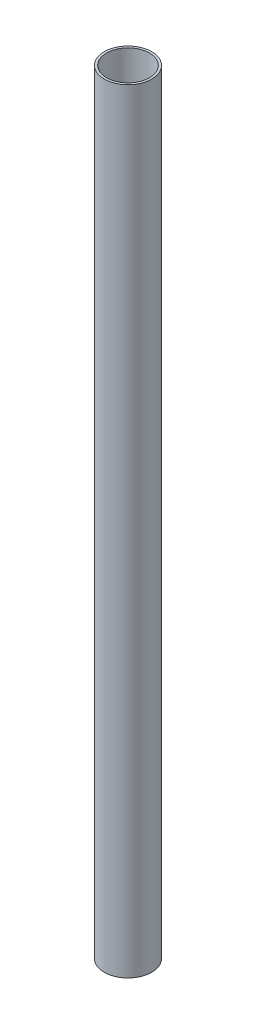
ISO-10303-21;
HEADER;
FILE_DESCRIPTION(('STEP AP214'),'2;1');
FILE_NAME('part.step','',(''),(''),'','','');
FILE_SCHEMA(('AUTOMOTIVE_DESIGN { 1 0 10303 214 1 1 1 1 }'));
ENDSEC;
DATA;
#1=APPLICATION_CONTEXT('core data for automotive mechanical design processes');
#2=APPLICATION_PROTOCOL_DEFINITION('international standard','automotive_design',2000,#1);
#3=PRODUCT_CONTEXT('',#1,'mechanical');
#4=PRODUCT('Part','Part','',(#3));
#5=PRODUCT_RELATED_PRODUCT_CATEGORY('part','',(#4));
#6=PRODUCT_DEFINITION_FORMATION('','',#4);
#7=PRODUCT_DEFINITION_CONTEXT('part definition',#1,'design');
#8=PRODUCT_DEFINITION('design','',#6,#7);
#9=PRODUCT_DEFINITION_SHAPE('','',#8);
#10=(LENGTH_UNIT() NAMED_UNIT(*) SI_UNIT(.MILLI.,.METRE.));
#11=(NAMED_UNIT(*) PLANE_ANGLE_UNIT() SI_UNIT($,.RADIAN.));
#12=(NAMED_UNIT(*) SI_UNIT($,.STERADIAN.) SOLID_ANGLE_UNIT());
#13=UNCERTAINTY_MEASURE_WITH_UNIT(LENGTH_MEASURE(1.E-05),#10,'distance_accuracy_value','');
#14=(GEOMETRIC_REPRESENTATION_CONTEXT(3) GLOBAL_UNCERTAINTY_ASSIGNED_CONTEXT((#13)) GLOBAL_UNIT_ASSIGNED_CONTEXT((#10,
#11,#12)) REPRESENTATION_CONTEXT('',''));
#15=CARTESIAN_POINT('',(0.,0.,0.));
#16=DIRECTION('',(0.,0.,1.));
#17=DIRECTION('',(1.,0.,0.));
#18=AXIS2_PLACEMENT_3D('',#15,#16,#17);
#19=CARTESIAN_POINT('',(0.,414.02,0.));
#20=DIRECTION('',(0.,1.,0.));
#21=DIRECTION('',(0.,0.,1.));
#22=AXIS2_PLACEMENT_3D('',#19,#20,#21);
#23=PLANE('',#22);
#24=CARTESIAN_POINT('',(0.,414.02,0.));
#25=DIRECTION('',(0.,1.,0.));
#26=DIRECTION('',(0.,0.,1.));
#27=AXIS2_PLACEMENT_3D('',#24,#25,#26);
#28=CIRCLE('',#27,12.7);
#29=CARTESIAN_POINT('',(0.,414.02,12.7));
#30=VERTEX_POINT('',#29);
#31=EDGE_CURVE('E10',#30,#30,#28,.T.);
#32=ORIENTED_EDGE('',*,*,#31,.T.);
#33=EDGE_LOOP('',(#32));
#34=FACE_BOUND('',#33,.T.);
#35=CARTESIAN_POINT('',(0.,414.02,0.));
#36=DIRECTION('',(0.,1.,0.));
#37=DIRECTION('',(0.,0.,1.));
#38=AXIS2_PLACEMENT_3D('',#35,#36,#37);
#39=CIRCLE('',#38,11.4935);
#40=CARTESIAN_POINT('',(0.,414.02,11.4935));
#41=VERTEX_POINT('',#40);
#42=EDGE_CURVE('E52',#41,#41,#39,.T.);
#43=ORIENTED_EDGE('',*,*,#42,.F.);
#44=EDGE_LOOP('',(#43));
#45=FACE_BOUND('',#44,.T.);
#46=ADVANCED_FACE('F41',(#34,#45),#23,.T.);
#47=CARTESIAN_POINT('',(0.,0.,0.));
#48=DIRECTION('',(0.,1.,0.));
#49=DIRECTION('',(0.,0.,1.));
#50=AXIS2_PLACEMENT_3D('',#47,#48,#49);
#51=PLANE('',#50);
#52=CARTESIAN_POINT('',(0.,0.,0.));
#53=DIRECTION('',(0.,1.,0.));
#54=DIRECTION('',(0.,0.,1.));
#55=AXIS2_PLACEMENT_3D('',#52,#53,#54);
#56=CIRCLE('',#55,12.7);
#57=CARTESIAN_POINT('',(0.,0.,12.7));
#58=VERTEX_POINT('',#57);
#59=EDGE_CURVE('E45',#58,#58,#56,.T.);
#60=ORIENTED_EDGE('',*,*,#59,.F.);
#61=EDGE_LOOP('',(#60));
#62=FACE_BOUND('',#61,.T.);
#63=CARTESIAN_POINT('',(0.,0.,0.));
#64=DIRECTION('',(0.,1.,0.));
#65=DIRECTION('',(0.,0.,1.));
#66=AXIS2_PLACEMENT_3D('',#63,#64,#65);
#67=CIRCLE('',#66,11.4935);
#68=CARTESIAN_POINT('',(0.,0.,11.4935));
#69=VERTEX_POINT('',#68);
#70=EDGE_CURVE('E54',#69,#69,#67,.T.);
#71=ORIENTED_EDGE('',*,*,#70,.T.);
#72=EDGE_LOOP('',(#71));
#73=FACE_BOUND('',#72,.T.);
#74=ADVANCED_FACE('F64',(#62,#73),#51,.F.);
#75=CARTESIAN_POINT('',(0.,414.02,0.));
#76=DIRECTION('',(0.,-1.,0.));
#77=DIRECTION('',(0.,0.,-1.));
#78=AXIS2_PLACEMENT_3D('',#75,#76,#77);
#79=CYLINDRICAL_SURFACE('',#78,12.7);
#80=ORIENTED_EDGE('',*,*,#31,.F.);
#81=EDGE_LOOP('',(#80));
#82=FACE_BOUND('',#81,.T.);
#83=ORIENTED_EDGE('',*,*,#59,.T.);
#84=EDGE_LOOP('',(#83));
#85=FACE_BOUND('',#84,.T.);
#86=ADVANCED_FACE('F43',(#82,#85),#79,.T.);
#87=CARTESIAN_POINT('',(0.,414.02,0.));
#88=DIRECTION('',(0.,-1.,0.));
#89=DIRECTION('',(0.,0.,-1.));
#90=AXIS2_PLACEMENT_3D('',#87,#88,#89);
#91=CYLINDRICAL_SURFACE('',#90,11.4935);
#92=ORIENTED_EDGE('',*,*,#42,.T.);
#93=EDGE_LOOP('',(#92));
#94=FACE_BOUND('',#93,.T.);
#95=ORIENTED_EDGE('',*,*,#70,.F.);
#96=EDGE_LOOP('',(#95));
#97=FACE_BOUND('',#96,.T.);
#98=ADVANCED_FACE('F60',(#94,#97),#91,.F.);
#99=CLOSED_SHELL('',(#46,#74,#86,#98));
#100=MANIFOLD_SOLID_BREP('B2',#99);
#101=ADVANCED_BREP_SHAPE_REPRESENTATION('',(#18,#100),#14);
#102=SHAPE_DEFINITION_REPRESENTATION(#9,#101);
ENDSEC;
END-ISO-10303-21;
